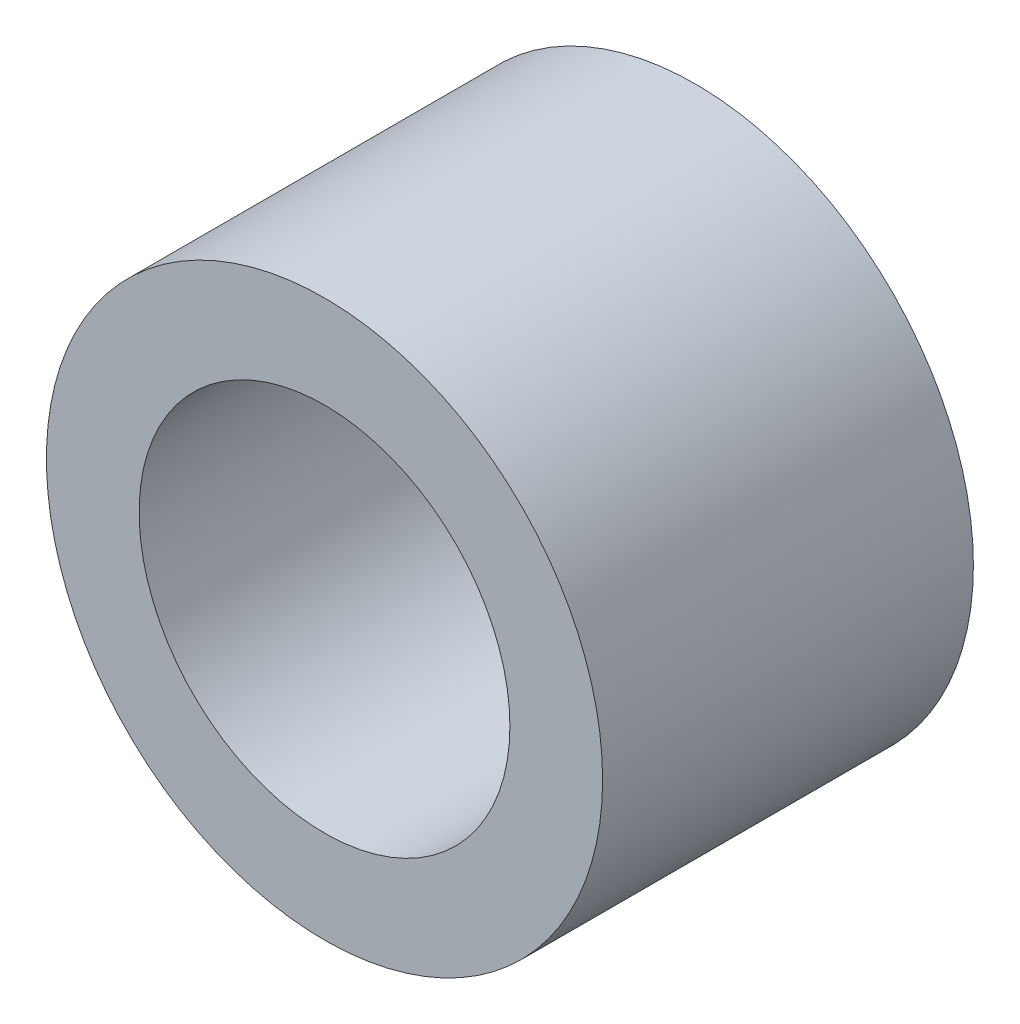
ISO-10303-21;
HEADER;
FILE_DESCRIPTION(('STEP AP214'),'2;1');
FILE_NAME('part.step','',(''),(''),'','','');
FILE_SCHEMA(('AUTOMOTIVE_DESIGN { 1 0 10303 214 1 1 1 1 }'));
ENDSEC;
DATA;
#1=APPLICATION_CONTEXT('core data for automotive mechanical design processes');
#2=APPLICATION_PROTOCOL_DEFINITION('international standard','automotive_design',2000,#1);
#3=PRODUCT_CONTEXT('',#1,'mechanical');
#4=PRODUCT('Part','Part','',(#3));
#5=PRODUCT_RELATED_PRODUCT_CATEGORY('part','',(#4));
#6=PRODUCT_DEFINITION_FORMATION('','',#4);
#7=PRODUCT_DEFINITION_CONTEXT('part definition',#1,'design');
#8=PRODUCT_DEFINITION('design','',#6,#7);
#9=PRODUCT_DEFINITION_SHAPE('','',#8);
#10=(LENGTH_UNIT() NAMED_UNIT(*) SI_UNIT(.MILLI.,.METRE.));
#11=(NAMED_UNIT(*) PLANE_ANGLE_UNIT() SI_UNIT($,.RADIAN.));
#12=(NAMED_UNIT(*) SI_UNIT($,.STERADIAN.) SOLID_ANGLE_UNIT());
#13=UNCERTAINTY_MEASURE_WITH_UNIT(LENGTH_MEASURE(1.E-05),#10,'distance_accuracy_value','');
#14=(GEOMETRIC_REPRESENTATION_CONTEXT(3) GLOBAL_UNCERTAINTY_ASSIGNED_CONTEXT((#13)) GLOBAL_UNIT_ASSIGNED_CONTEXT((#10,
#11,#12)) REPRESENTATION_CONTEXT('',''));
#15=CARTESIAN_POINT('',(0.,0.,0.));
#16=DIRECTION('',(0.,0.,1.));
#17=DIRECTION('',(1.,0.,0.));
#18=AXIS2_PLACEMENT_3D('',#15,#16,#17);
#19=CARTESIAN_POINT('',(0.,0.,12.7));
#20=DIRECTION('',(0.,0.,1.));
#21=DIRECTION('',(1.,0.,0.));
#22=AXIS2_PLACEMENT_3D('',#19,#20,#21);
#23=PLANE('',#22);
#24=CARTESIAN_POINT('',(0.,0.,12.7));
#25=DIRECTION('',(0.,0.,1.));
#26=DIRECTION('',(1.,0.,0.));
#27=AXIS2_PLACEMENT_3D('',#24,#25,#26);
#28=CIRCLE('',#27,9.525);
#29=CARTESIAN_POINT('',(9.525,0.,12.7));
#30=VERTEX_POINT('',#29);
#31=EDGE_CURVE('E10',#30,#30,#28,.T.);
#32=ORIENTED_EDGE('',*,*,#31,.T.);
#33=EDGE_LOOP('',(#32));
#34=FACE_BOUND('',#33,.T.);
#35=CARTESIAN_POINT('',(0.,0.,12.7));
#36=DIRECTION('',(0.,0.,1.));
#37=DIRECTION('',(1.,0.,0.));
#38=AXIS2_PLACEMENT_3D('',#35,#36,#37);
#39=CIRCLE('',#38,6.35);
#40=CARTESIAN_POINT('',(6.35,0.,12.7));
#41=VERTEX_POINT('',#40);
#42=EDGE_CURVE('E42',#41,#41,#39,.T.);
#43=ORIENTED_EDGE('',*,*,#42,.F.);
#44=EDGE_LOOP('',(#43));
#45=FACE_BOUND('',#44,.T.);
#46=ADVANCED_FACE('F31',(#34,#45),#23,.T.);
#47=CARTESIAN_POINT('',(0.,0.,0.));
#48=DIRECTION('',(0.,0.,1.));
#49=DIRECTION('',(1.,0.,0.));
#50=AXIS2_PLACEMENT_3D('',#47,#48,#49);
#51=PLANE('',#50);
#52=CARTESIAN_POINT('',(0.,0.,0.));
#53=DIRECTION('',(0.,0.,1.));
#54=DIRECTION('',(1.,0.,0.));
#55=AXIS2_PLACEMENT_3D('',#52,#53,#54);
#56=CIRCLE('',#55,9.525);
#57=CARTESIAN_POINT('',(9.525,0.,0.));
#58=VERTEX_POINT('',#57);
#59=EDGE_CURVE('E35',#58,#58,#56,.T.);
#60=ORIENTED_EDGE('',*,*,#59,.F.);
#61=EDGE_LOOP('',(#60));
#62=FACE_BOUND('',#61,.T.);
#63=CARTESIAN_POINT('',(0.,0.,0.));
#64=DIRECTION('',(0.,0.,1.));
#65=DIRECTION('',(1.,0.,0.));
#66=AXIS2_PLACEMENT_3D('',#63,#64,#65);
#67=CIRCLE('',#66,6.35);
#68=CARTESIAN_POINT('',(6.35,0.,0.));
#69=VERTEX_POINT('',#68);
#70=EDGE_CURVE('E44',#69,#69,#67,.T.);
#71=ORIENTED_EDGE('',*,*,#70,.T.);
#72=EDGE_LOOP('',(#71));
#73=FACE_BOUND('',#72,.T.);
#74=ADVANCED_FACE('F54',(#62,#73),#51,.F.);
#75=CARTESIAN_POINT('',(0.,0.,12.7));
#76=DIRECTION('',(0.,0.,-1.));
#77=DIRECTION('',(-1.,0.,0.));
#78=AXIS2_PLACEMENT_3D('',#75,#76,#77);
#79=CYLINDRICAL_SURFACE('',#78,9.525);
#80=ORIENTED_EDGE('',*,*,#31,.F.);
#81=EDGE_LOOP('',(#80));
#82=FACE_BOUND('',#81,.T.);
#83=ORIENTED_EDGE('',*,*,#59,.T.);
#84=EDGE_LOOP('',(#83));
#85=FACE_BOUND('',#84,.T.);
#86=ADVANCED_FACE('F33',(#82,#85),#79,.T.);
#87=CARTESIAN_POINT('',(0.,0.,12.7));
#88=DIRECTION('',(0.,0.,-1.));
#89=DIRECTION('',(-1.,0.,0.));
#90=AXIS2_PLACEMENT_3D('',#87,#88,#89);
#91=CYLINDRICAL_SURFACE('',#90,6.35);
#92=ORIENTED_EDGE('',*,*,#42,.T.);
#93=EDGE_LOOP('',(#92));
#94=FACE_BOUND('',#93,.T.);
#95=ORIENTED_EDGE('',*,*,#70,.F.);
#96=EDGE_LOOP('',(#95));
#97=FACE_BOUND('',#96,.T.);
#98=ADVANCED_FACE('F50',(#94,#97),#91,.F.);
#99=CLOSED_SHELL('',(#46,#74,#86,#98));
#100=MANIFOLD_SOLID_BREP('B2',#99);
#101=ADVANCED_BREP_SHAPE_REPRESENTATION('',(#18,#100),#14);
#102=SHAPE_DEFINITION_REPRESENTATION(#9,#101);
ENDSEC;
END-ISO-10303-21;
